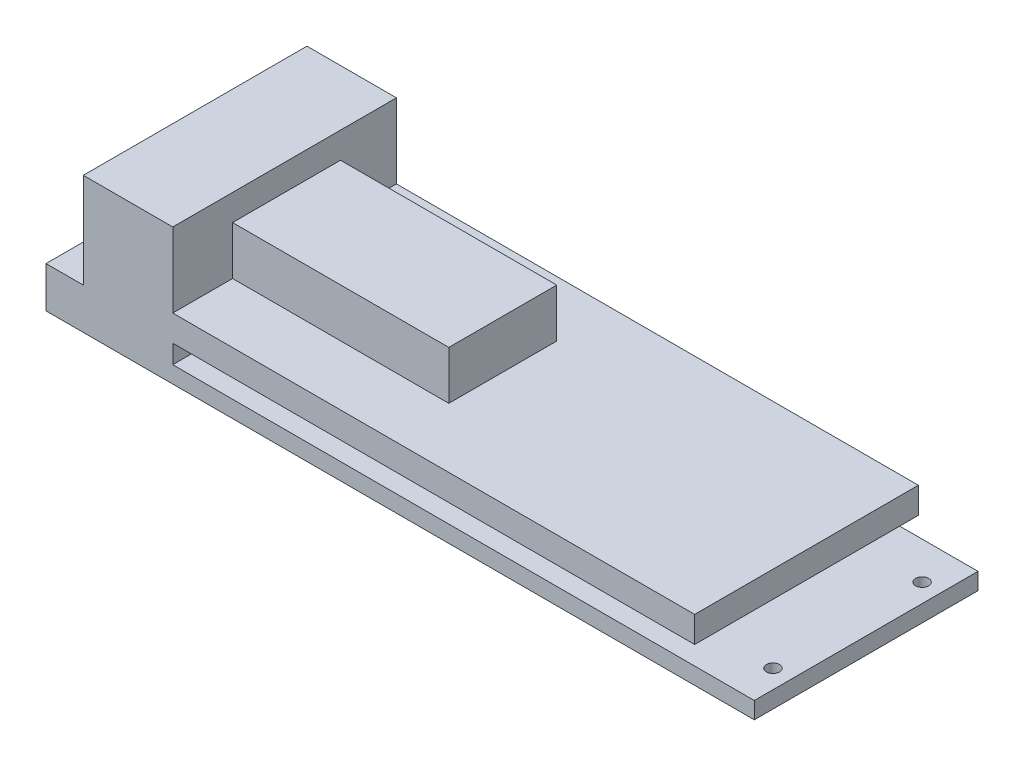
ISO-10303-21;
HEADER;
FILE_DESCRIPTION(('STEP AP214'),'2;1');
FILE_NAME('part.step','',(''),(''),'','','');
FILE_SCHEMA(('AUTOMOTIVE_DESIGN { 1 0 10303 214 1 1 1 1 }'));
ENDSEC;
DATA;
#1=APPLICATION_CONTEXT('core data for automotive mechanical design processes');
#2=APPLICATION_PROTOCOL_DEFINITION('international standard','automotive_design',2000,#1);
#3=PRODUCT_CONTEXT('',#1,'mechanical');
#4=PRODUCT('Part','Part','',(#3));
#5=PRODUCT_RELATED_PRODUCT_CATEGORY('part','',(#4));
#6=PRODUCT_DEFINITION_FORMATION('','',#4);
#7=PRODUCT_DEFINITION_CONTEXT('part definition',#1,'design');
#8=PRODUCT_DEFINITION('design','',#6,#7);
#9=PRODUCT_DEFINITION_SHAPE('','',#8);
#10=(LENGTH_UNIT() NAMED_UNIT(*) SI_UNIT(.MILLI.,.METRE.));
#11=(NAMED_UNIT(*) PLANE_ANGLE_UNIT() SI_UNIT($,.RADIAN.));
#12=(NAMED_UNIT(*) SI_UNIT($,.STERADIAN.) SOLID_ANGLE_UNIT());
#13=UNCERTAINTY_MEASURE_WITH_UNIT(LENGTH_MEASURE(1.E-05),#10,'distance_accuracy_value','');
#14=(GEOMETRIC_REPRESENTATION_CONTEXT(3) GLOBAL_UNCERTAINTY_ASSIGNED_CONTEXT((#13)) GLOBAL_UNIT_ASSIGNED_CONTEXT((#10,
#11,#12)) REPRESENTATION_CONTEXT('',''));
#15=CARTESIAN_POINT('',(0.,0.,0.));
#16=DIRECTION('',(0.,0.,1.));
#17=DIRECTION('',(1.,0.,0.));
#18=AXIS2_PLACEMENT_3D('',#15,#16,#17);
#19=CARTESIAN_POINT('',(-61.,36.5,-30.));
#20=DIRECTION('',(-1.,0.,0.));
#21=DIRECTION('',(0.,0.,1.));
#22=AXIS2_PLACEMENT_3D('',#19,#20,#21);
#23=PLANE('',#22);
#24=DIRECTION('',(0.,-1.,0.));
#25=VECTOR('',#24,1.);
#26=CARTESIAN_POINT('',(-61.,29.5,13.9538213025226));
#27=LINE('',#26,#25);
#28=CARTESIAN_POINT('',(-61.,29.5,13.9538213025226));
#29=VERTEX_POINT('',#28);
#30=CARTESIAN_POINT('',(-61.,16.5,13.9538213025226));
#31=VERTEX_POINT('',#30);
#32=EDGE_CURVE('E186',#29,#31,#27,.T.);
#33=ORIENTED_EDGE('',*,*,#32,.F.);
#34=DIRECTION('',(0.,0.,1.));
#35=VECTOR('',#34,1.);
#36=CARTESIAN_POINT('',(-61.,29.5,-15.));
#37=LINE('',#36,#35);
#38=CARTESIAN_POINT('',(-61.,29.5,-15.));
#39=VERTEX_POINT('',#38);
#40=EDGE_CURVE('E194',#39,#29,#37,.T.);
#41=ORIENTED_EDGE('',*,*,#40,.F.);
#42=DIRECTION('',(0.,-1.,0.));
#43=VECTOR('',#42,1.);
#44=CARTESIAN_POINT('',(-61.,29.5,-15.));
#45=LINE('',#44,#43);
#46=CARTESIAN_POINT('',(-61.,16.5,-15.));
#47=VERTEX_POINT('',#46);
#48=EDGE_CURVE('E413',#39,#47,#45,.T.);
#49=ORIENTED_EDGE('',*,*,#48,.T.);
#50=DIRECTION('',(0.,0.,1.));
#51=VECTOR('',#50,1.);
#52=CARTESIAN_POINT('',(-61.,16.5,-30.));
#53=LINE('',#52,#51);
#54=CARTESIAN_POINT('',(-61.,16.5,-30.));
#55=VERTEX_POINT('',#54);
#56=EDGE_CURVE('E217',#55,#47,#53,.T.);
#57=ORIENTED_EDGE('',*,*,#56,.F.);
#58=DIRECTION('',(0.,-1.,0.));
#59=VECTOR('',#58,1.);
#60=CARTESIAN_POINT('',(-61.,36.5,-30.));
#61=LINE('',#60,#59);
#62=CARTESIAN_POINT('',(-61.,36.5,-30.));
#63=VERTEX_POINT('',#62);
#64=EDGE_CURVE('E297',#63,#55,#61,.T.);
#65=ORIENTED_EDGE('',*,*,#64,.F.);
#66=DIRECTION('',(0.,0.,-1.));
#67=VECTOR('',#66,1.);
#68=CARTESIAN_POINT('',(-61.,36.5,-30.));
#69=LINE('',#68,#67);
#70=CARTESIAN_POINT('',(-61.,36.5,30.));
#71=VERTEX_POINT('',#70);
#72=EDGE_CURVE('E284',#71,#63,#69,.T.);
#73=ORIENTED_EDGE('',*,*,#72,.F.);
#74=DIRECTION('',(0.,-1.,0.));
#75=VECTOR('',#74,1.);
#76=CARTESIAN_POINT('',(-61.,36.5,30.));
#77=LINE('',#76,#75);
#78=CARTESIAN_POINT('',(-61.,16.5,30.));
#79=VERTEX_POINT('',#78);
#80=EDGE_CURVE('E302',#71,#79,#77,.T.);
#81=ORIENTED_EDGE('',*,*,#80,.T.);
#82=EDGE_CURVE('E207',#31,#79,#53,.T.);
#83=ORIENTED_EDGE('',*,*,#82,.F.);
#84=EDGE_LOOP('',(#33,#41,#49,#57,#65,#73,#81,#83));
#85=FACE_BOUND('',#84,.T.);
#86=ADVANCED_FACE('F43',(#85),#23,.F.);
#87=CARTESIAN_POINT('',(0.,16.5,0.));
#88=DIRECTION('',(0.,1.,0.));
#89=DIRECTION('',(0.,0.,1.));
#90=AXIS2_PLACEMENT_3D('',#87,#88,#89);
#91=PLANE('',#90);
#92=DIRECTION('',(0.,0.,-1.));
#93=VECTOR('',#92,1.);
#94=CARTESIAN_POINT('',(-2.99999999999999,16.5,-15.));
#95=LINE('',#94,#93);
#96=CARTESIAN_POINT('',(-2.99999999999999,16.5,13.9538213025226));
#97=VERTEX_POINT('',#96);
#98=CARTESIAN_POINT('',(-2.99999999999999,16.5,-15.));
#99=VERTEX_POINT('',#98);
#100=EDGE_CURVE('E416',#97,#99,#95,.T.);
#101=ORIENTED_EDGE('',*,*,#100,.F.);
#102=DIRECTION('',(1.,0.,0.));
#103=VECTOR('',#102,1.);
#104=CARTESIAN_POINT('',(-61.,16.5,13.9538213025226));
#105=LINE('',#104,#103);
#106=EDGE_CURVE('E399',#31,#97,#105,.T.);
#107=ORIENTED_EDGE('',*,*,#106,.F.);
#108=ORIENTED_EDGE('',*,*,#82,.T.);
#109=DIRECTION('',(1.,0.,0.));
#110=VECTOR('',#109,1.);
#111=CARTESIAN_POINT('',(-61.,16.5,30.));
#112=LINE('',#111,#110);
#113=CARTESIAN_POINT('',(79.,16.5,30.));
#114=VERTEX_POINT('',#113);
#115=EDGE_CURVE('E221',#79,#114,#112,.T.);
#116=ORIENTED_EDGE('',*,*,#115,.T.);
#117=DIRECTION('',(0.,0.,-1.));
#118=VECTOR('',#117,1.);
#119=CARTESIAN_POINT('',(79.,16.5,-30.));
#120=LINE('',#119,#118);
#121=CARTESIAN_POINT('',(79.,16.5,-30.));
#122=VERTEX_POINT('',#121);
#123=EDGE_CURVE('E224',#114,#122,#120,.T.);
#124=ORIENTED_EDGE('',*,*,#123,.T.);
#125=DIRECTION('',(-1.,0.,0.));
#126=VECTOR('',#125,1.);
#127=CARTESIAN_POINT('',(-61.,16.5,-30.));
#128=LINE('',#127,#126);
#129=EDGE_CURVE('E227',#122,#55,#128,.T.);
#130=ORIENTED_EDGE('',*,*,#129,.T.);
#131=ORIENTED_EDGE('',*,*,#56,.T.);
#132=DIRECTION('',(-1.,0.,0.));
#133=VECTOR('',#132,1.);
#134=CARTESIAN_POINT('',(-61.,16.5,-15.));
#135=LINE('',#134,#133);
#136=EDGE_CURVE('E203',#99,#47,#135,.T.);
#137=ORIENTED_EDGE('',*,*,#136,.F.);
#138=EDGE_LOOP('',(#101,#107,#108,#116,#124,#130,#131,#137));
#139=FACE_BOUND('',#138,.T.);
#140=ADVANCED_FACE('F427',(#139),#91,.T.);
#141=DIRECTION('',(0.,0.,1.));
#142=VECTOR('',#141,1.);
#143=CARTESIAN_POINT('',(-61.,9.5,-30.));
#144=LINE('',#143,#142);
#145=CARTESIAN_POINT('',(-61.,9.5,-30.));
#146=VERTEX_POINT('',#145);
#147=CARTESIAN_POINT('',(-61.,9.5,30.));
#148=VERTEX_POINT('',#147);
#149=EDGE_CURVE('E69',#146,#148,#144,.T.);
#150=ORIENTED_EDGE('',*,*,#149,.T.);
#151=CARTESIAN_POINT('',(-61.,4.5,30.));
#152=VERTEX_POINT('',#151);
#153=EDGE_CURVE('E301',#148,#152,#77,.T.);
#154=ORIENTED_EDGE('',*,*,#153,.T.);
#155=DIRECTION('',(0.,0.,-1.));
#156=VECTOR('',#155,1.);
#157=CARTESIAN_POINT('',(-61.,4.5,-30.));
#158=LINE('',#157,#156);
#159=CARTESIAN_POINT('',(-61.,4.5,-30.));
#160=VERTEX_POINT('',#159);
#161=EDGE_CURVE('E276',#152,#160,#158,.T.);
#162=ORIENTED_EDGE('',*,*,#161,.T.);
#163=EDGE_CURVE('E296',#146,#160,#61,.T.);
#164=ORIENTED_EDGE('',*,*,#163,.F.);
#165=EDGE_LOOP('',(#150,#154,#162,#164));
#166=FACE_BOUND('',#165,.T.);
#167=ADVANCED_FACE('F451',(#166),#23,.F.);
#168=CARTESIAN_POINT('',(-85.,36.5,-30.));
#169=DIRECTION('',(1.,0.,0.));
#170=DIRECTION('',(0.,0.,-1.));
#171=AXIS2_PLACEMENT_3D('',#168,#169,#170);
#172=PLANE('',#171);
#173=DIRECTION('',(0.,0.,-1.));
#174=VECTOR('',#173,1.);
#175=CARTESIAN_POINT('',(-85.,11.,-30.));
#176=LINE('',#175,#174);
#177=CARTESIAN_POINT('',(-85.,11.,30.));
#178=VERTEX_POINT('',#177);
#179=CARTESIAN_POINT('',(-85.,11.,-30.));
#180=VERTEX_POINT('',#179);
#181=EDGE_CURVE('E317',#178,#180,#176,.T.);
#182=ORIENTED_EDGE('',*,*,#181,.F.);
#183=DIRECTION('',(0.,-1.,0.));
#184=VECTOR('',#183,1.);
#185=CARTESIAN_POINT('',(-85.,36.5,30.));
#186=LINE('',#185,#184);
#187=CARTESIAN_POINT('',(-85.,36.5,30.));
#188=VERTEX_POINT('',#187);
#189=EDGE_CURVE('E305',#188,#178,#186,.T.);
#190=ORIENTED_EDGE('',*,*,#189,.F.);
#191=DIRECTION('',(0.,0.,1.));
#192=VECTOR('',#191,1.);
#193=CARTESIAN_POINT('',(-85.,36.5,-30.));
#194=LINE('',#193,#192);
#195=CARTESIAN_POINT('',(-85.,36.5,-30.));
#196=VERTEX_POINT('',#195);
#197=EDGE_CURVE('E277',#196,#188,#194,.T.);
#198=ORIENTED_EDGE('',*,*,#197,.F.);
#199=DIRECTION('',(0.,-1.,0.));
#200=VECTOR('',#199,1.);
#201=CARTESIAN_POINT('',(-85.,36.5,-30.));
#202=LINE('',#201,#200);
#203=EDGE_CURVE('E290',#196,#180,#202,.T.);
#204=ORIENTED_EDGE('',*,*,#203,.T.);
#205=EDGE_LOOP('',(#182,#190,#198,#204));
#206=FACE_BOUND('',#205,.T.);
#207=DIRECTION('',(0.,0.,-1.));
#208=VECTOR('',#207,1.);
#209=CARTESIAN_POINT('',(-85.,26.,-30.));
#210=LINE('',#209,#208);
#211=CARTESIAN_POINT('',(-85.,26.,12.9191431582392));
#212=VERTEX_POINT('',#211);
#213=CARTESIAN_POINT('',(-85.,26.,-12.0808568417608));
#214=VERTEX_POINT('',#213);
#215=EDGE_CURVE('E11',#212,#214,#210,.T.);
#216=ORIENTED_EDGE('',*,*,#215,.F.);
#217=DIRECTION('',(0.,1.,0.));
#218=VECTOR('',#217,1.);
#219=CARTESIAN_POINT('',(-85.,36.5,12.9191431582392));
#220=LINE('',#219,#218);
#221=CARTESIAN_POINT('',(-85.,19.,12.9191431582392));
#222=VERTEX_POINT('',#221);
#223=EDGE_CURVE('E385',#222,#212,#220,.T.);
#224=ORIENTED_EDGE('',*,*,#223,.F.);
#225=DIRECTION('',(0.,0.,-1.));
#226=VECTOR('',#225,1.);
#227=CARTESIAN_POINT('',(-85.,19.,-30.));
#228=LINE('',#227,#226);
#229=CARTESIAN_POINT('',(-85.,19.,-12.0808568417608));
#230=VERTEX_POINT('',#229);
#231=EDGE_CURVE('E381',#222,#230,#228,.T.);
#232=ORIENTED_EDGE('',*,*,#231,.T.);
#233=DIRECTION('',(0.,-1.,0.));
#234=VECTOR('',#233,1.);
#235=CARTESIAN_POINT('',(-85.,36.5,-12.0808568417608));
#236=LINE('',#235,#234);
#237=EDGE_CURVE('E53',#214,#230,#236,.T.);
#238=ORIENTED_EDGE('',*,*,#237,.F.);
#239=EDGE_LOOP('',(#216,#224,#232,#238));
#240=FACE_BOUND('',#239,.T.);
#241=ADVANCED_FACE('F487',(#206,#240),#172,.F.);
#242=CARTESIAN_POINT('',(0.,4.5,0.));
#243=DIRECTION('',(0.,1.,0.));
#244=DIRECTION('',(0.,0.,1.));
#245=AXIS2_PLACEMENT_3D('',#242,#243,#244);
#246=PLANE('',#245);
#247=CARTESIAN_POINT('',(90.,4.5,20.));
#248=DIRECTION('',(0.,1.,0.));
#249=DIRECTION('',(0.,0.,1.));
#250=AXIS2_PLACEMENT_3D('',#247,#248,#249);
#251=CIRCLE('',#250,1.75);
#252=CARTESIAN_POINT('',(90.,4.5,21.75));
#253=VERTEX_POINT('',#252);
#254=EDGE_CURVE('E334',#253,#253,#251,.T.);
#255=ORIENTED_EDGE('',*,*,#254,.F.);
#256=EDGE_LOOP('',(#255));
#257=FACE_BOUND('',#256,.T.);
#258=CARTESIAN_POINT('',(90.,4.5,-20.));
#259=DIRECTION('',(0.,1.,0.));
#260=DIRECTION('',(0.,0.,1.));
#261=AXIS2_PLACEMENT_3D('',#258,#259,#260);
#262=CIRCLE('',#261,1.75);
#263=CARTESIAN_POINT('',(90.,4.5,-18.25));
#264=VERTEX_POINT('',#263);
#265=EDGE_CURVE('E326',#264,#264,#262,.T.);
#266=ORIENTED_EDGE('',*,*,#265,.F.);
#267=EDGE_LOOP('',(#266));
#268=FACE_BOUND('',#267,.T.);
#269=DIRECTION('',(-1.,0.,0.));
#270=VECTOR('',#269,1.);
#271=CARTESIAN_POINT('',(-95.,4.5,-30.));
#272=LINE('',#271,#270);
#273=CARTESIAN_POINT('',(95.,4.5,-30.));
#274=VERTEX_POINT('',#273);
#275=EDGE_CURVE('E346',#274,#160,#272,.T.);
#276=ORIENTED_EDGE('',*,*,#275,.T.);
#277=ORIENTED_EDGE('',*,*,#161,.F.);
#278=DIRECTION('',(1.,0.,0.));
#279=VECTOR('',#278,1.);
#280=CARTESIAN_POINT('',(-95.,4.5,30.));
#281=LINE('',#280,#279);
#282=CARTESIAN_POINT('',(95.,4.5,30.));
#283=VERTEX_POINT('',#282);
#284=EDGE_CURVE('E351',#152,#283,#281,.T.);
#285=ORIENTED_EDGE('',*,*,#284,.T.);
#286=DIRECTION('',(0.,0.,-1.));
#287=VECTOR('',#286,1.);
#288=CARTESIAN_POINT('',(95.,4.5,-30.));
#289=LINE('',#288,#287);
#290=EDGE_CURVE('E342',#283,#274,#289,.T.);
#291=ORIENTED_EDGE('',*,*,#290,.T.);
#292=EDGE_LOOP('',(#276,#277,#285,#291));
#293=FACE_BOUND('',#292,.T.);
#294=ADVANCED_FACE('F454',(#257,#268,#293),#246,.T.);
#295=CARTESIAN_POINT('',(0.,0.,0.));
#296=DIRECTION('',(0.,1.,0.));
#297=DIRECTION('',(0.,0.,1.));
#298=AXIS2_PLACEMENT_3D('',#295,#296,#297);
#299=PLANE('',#298);
#300=CARTESIAN_POINT('',(-89.,0.,-20.));
#301=DIRECTION('',(0.,-1.,0.));
#302=DIRECTION('',(0.,0.,-1.));
#303=AXIS2_PLACEMENT_3D('',#300,#301,#302);
#304=CIRCLE('',#303,1.75);
#305=CARTESIAN_POINT('',(-89.,0.,-21.75));
#306=VERTEX_POINT('',#305);
#307=EDGE_CURVE('E393',#306,#306,#304,.T.);
#308=ORIENTED_EDGE('',*,*,#307,.F.);
#309=EDGE_LOOP('',(#308));
#310=FACE_BOUND('',#309,.T.);
#311=CARTESIAN_POINT('',(-89.,0.,19.9554648735045));
#312=DIRECTION('',(0.,-1.,0.));
#313=DIRECTION('',(0.,0.,-1.));
#314=AXIS2_PLACEMENT_3D('',#311,#312,#313);
#315=CIRCLE('',#314,1.75);
#316=CARTESIAN_POINT('',(-89.,0.,18.2054648735045));
#317=VERTEX_POINT('',#316);
#318=EDGE_CURVE('E401',#317,#317,#315,.T.);
#319=ORIENTED_EDGE('',*,*,#318,.F.);
#320=EDGE_LOOP('',(#319));
#321=FACE_BOUND('',#320,.T.);
#322=DIRECTION('',(0.,0.,-1.));
#323=VECTOR('',#322,1.);
#324=CARTESIAN_POINT('',(95.,0.,-30.));
#325=LINE('',#324,#323);
#326=CARTESIAN_POINT('',(95.,0.,30.));
#327=VERTEX_POINT('',#326);
#328=CARTESIAN_POINT('',(95.,0.,-30.));
#329=VERTEX_POINT('',#328);
#330=EDGE_CURVE('E338',#327,#329,#325,.T.);
#331=ORIENTED_EDGE('',*,*,#330,.F.);
#332=DIRECTION('',(1.,0.,0.));
#333=VECTOR('',#332,1.);
#334=CARTESIAN_POINT('',(-95.,0.,30.));
#335=LINE('',#334,#333);
#336=CARTESIAN_POINT('',(-95.,0.,30.));
#337=VERTEX_POINT('',#336);
#338=EDGE_CURVE('E347',#337,#327,#335,.T.);
#339=ORIENTED_EDGE('',*,*,#338,.F.);
#340=DIRECTION('',(0.,0.,1.));
#341=VECTOR('',#340,1.);
#342=CARTESIAN_POINT('',(-95.,0.,-30.));
#343=LINE('',#342,#341);
#344=CARTESIAN_POINT('',(-95.,0.,-30.));
#345=VERTEX_POINT('',#344);
#346=EDGE_CURVE('E361',#345,#337,#343,.T.);
#347=ORIENTED_EDGE('',*,*,#346,.F.);
#348=DIRECTION('',(-1.,0.,0.));
#349=VECTOR('',#348,1.);
#350=CARTESIAN_POINT('',(-95.,0.,-30.));
#351=LINE('',#350,#349);
#352=EDGE_CURVE('E358',#329,#345,#351,.T.);
#353=ORIENTED_EDGE('',*,*,#352,.F.);
#354=EDGE_LOOP('',(#331,#339,#347,#353));
#355=FACE_BOUND('',#354,.T.);
#356=CARTESIAN_POINT('',(90.,0.,20.));
#357=DIRECTION('',(0.,1.,0.));
#358=DIRECTION('',(0.,0.,1.));
#359=AXIS2_PLACEMENT_3D('',#356,#357,#358);
#360=CIRCLE('',#359,1.75);
#361=CARTESIAN_POINT('',(90.,0.,21.75));
#362=VERTEX_POINT('',#361);
#363=EDGE_CURVE('E330',#362,#362,#360,.T.);
#364=ORIENTED_EDGE('',*,*,#363,.T.);
#365=EDGE_LOOP('',(#364));
#366=FACE_BOUND('',#365,.T.);
#367=CARTESIAN_POINT('',(90.,0.,-20.));
#368=DIRECTION('',(0.,1.,0.));
#369=DIRECTION('',(0.,0.,1.));
#370=AXIS2_PLACEMENT_3D('',#367,#368,#369);
#371=CIRCLE('',#370,1.75);
#372=CARTESIAN_POINT('',(90.,0.,-18.25));
#373=VERTEX_POINT('',#372);
#374=EDGE_CURVE('E325',#373,#373,#371,.T.);
#375=ORIENTED_EDGE('',*,*,#374,.T.);
#376=EDGE_LOOP('',(#375));
#377=FACE_BOUND('',#376,.T.);
#378=ADVANCED_FACE('F495',(#310,#321,#355,#366,#377),#299,.F.);
#379=CARTESIAN_POINT('',(95.,4.5,-30.));
#380=DIRECTION('',(-1.,0.,0.));
#381=DIRECTION('',(0.,0.,1.));
#382=AXIS2_PLACEMENT_3D('',#379,#380,#381);
#383=PLANE('',#382);
#384=ORIENTED_EDGE('',*,*,#330,.T.);
#385=DIRECTION('',(0.,-1.,0.));
#386=VECTOR('',#385,1.);
#387=CARTESIAN_POINT('',(95.,4.5,-30.));
#388=LINE('',#387,#386);
#389=EDGE_CURVE('E377',#274,#329,#388,.T.);
#390=ORIENTED_EDGE('',*,*,#389,.F.);
#391=ORIENTED_EDGE('',*,*,#290,.F.);
#392=DIRECTION('',(0.,-1.,0.));
#393=VECTOR('',#392,1.);
#394=CARTESIAN_POINT('',(95.,4.5,30.));
#395=LINE('',#394,#393);
#396=EDGE_CURVE('E354',#283,#327,#395,.T.);
#397=ORIENTED_EDGE('',*,*,#396,.T.);
#398=EDGE_LOOP('',(#384,#390,#391,#397));
#399=FACE_BOUND('',#398,.T.);
#400=ADVANCED_FACE('F45',(#399),#383,.F.);
#401=CARTESIAN_POINT('',(-95.,4.5,-30.));
#402=DIRECTION('',(0.,0.,1.));
#403=DIRECTION('',(1.,0.,0.));
#404=AXIS2_PLACEMENT_3D('',#401,#402,#403);
#405=PLANE('',#404);
#406=ORIENTED_EDGE('',*,*,#352,.T.);
#407=DIRECTION('',(0.,-1.,0.));
#408=VECTOR('',#407,1.);
#409=CARTESIAN_POINT('',(-95.,4.5,-30.));
#410=LINE('',#409,#408);
#411=CARTESIAN_POINT('',(-95.,11.,-30.));
#412=VERTEX_POINT('',#411);
#413=EDGE_CURVE('E373',#412,#345,#410,.T.);
#414=ORIENTED_EDGE('',*,*,#413,.F.);
#415=DIRECTION('',(-1.,0.,0.));
#416=VECTOR('',#415,1.);
#417=CARTESIAN_POINT('',(-95.,11.,-30.));
#418=LINE('',#417,#416);
#419=EDGE_CURVE('E321',#180,#412,#418,.T.);
#420=ORIENTED_EDGE('',*,*,#419,.F.);
#421=ORIENTED_EDGE('',*,*,#203,.F.);
#422=DIRECTION('',(-1.,0.,0.));
#423=VECTOR('',#422,1.);
#424=CARTESIAN_POINT('',(-85.,36.5,-30.));
#425=LINE('',#424,#423);
#426=EDGE_CURVE('E287',#63,#196,#425,.T.);
#427=ORIENTED_EDGE('',*,*,#426,.F.);
#428=ORIENTED_EDGE('',*,*,#64,.T.);
#429=ORIENTED_EDGE('',*,*,#129,.F.);
#430=DIRECTION('',(0.,-1.,0.));
#431=VECTOR('',#430,1.);
#432=CARTESIAN_POINT('',(79.,16.5,-30.));
#433=LINE('',#432,#431);
#434=CARTESIAN_POINT('',(79.,9.5,-30.));
#435=VERTEX_POINT('',#434);
#436=EDGE_CURVE('E230',#122,#435,#433,.T.);
#437=ORIENTED_EDGE('',*,*,#436,.T.);
#438=DIRECTION('',(-1.,0.,0.));
#439=VECTOR('',#438,1.);
#440=CARTESIAN_POINT('',(-61.,9.5,-30.));
#441=LINE('',#440,#439);
#442=EDGE_CURVE('E237',#435,#146,#441,.T.);
#443=ORIENTED_EDGE('',*,*,#442,.T.);
#444=ORIENTED_EDGE('',*,*,#163,.T.);
#445=ORIENTED_EDGE('',*,*,#275,.F.);
#446=ORIENTED_EDGE('',*,*,#389,.T.);
#447=EDGE_LOOP('',(#406,#414,#420,#421,#427,#428,#429,#437,#443,#444,#445,#446));
#448=FACE_BOUND('',#447,.T.);
#449=ADVANCED_FACE('F432',(#448),#405,.F.);
#450=CARTESIAN_POINT('',(-95.,4.5,-30.));
#451=DIRECTION('',(1.,0.,0.));
#452=DIRECTION('',(0.,0.,-1.));
#453=AXIS2_PLACEMENT_3D('',#450,#451,#452);
#454=PLANE('',#453);
#455=ORIENTED_EDGE('',*,*,#346,.T.);
#456=DIRECTION('',(0.,-1.,0.));
#457=VECTOR('',#456,1.);
#458=CARTESIAN_POINT('',(-95.,4.5,30.));
#459=LINE('',#458,#457);
#460=CARTESIAN_POINT('',(-95.,11.,30.));
#461=VERTEX_POINT('',#460);
#462=EDGE_CURVE('E369',#461,#337,#459,.T.);
#463=ORIENTED_EDGE('',*,*,#462,.F.);
#464=DIRECTION('',(0.,0.,1.));
#465=VECTOR('',#464,1.);
#466=CARTESIAN_POINT('',(-95.,11.,-30.));
#467=LINE('',#466,#465);
#468=EDGE_CURVE('E309',#412,#461,#467,.T.);
#469=ORIENTED_EDGE('',*,*,#468,.F.);
#470=ORIENTED_EDGE('',*,*,#413,.T.);
#471=EDGE_LOOP('',(#455,#463,#469,#470));
#472=FACE_BOUND('',#471,.T.);
#473=ADVANCED_FACE('F517',(#472),#454,.F.);
#474=CARTESIAN_POINT('',(-95.,4.5,30.));
#475=DIRECTION('',(0.,0.,-1.));
#476=DIRECTION('',(-1.,0.,0.));
#477=AXIS2_PLACEMENT_3D('',#474,#475,#476);
#478=PLANE('',#477);
#479=ORIENTED_EDGE('',*,*,#284,.F.);
#480=ORIENTED_EDGE('',*,*,#153,.F.);
#481=DIRECTION('',(1.,0.,0.));
#482=VECTOR('',#481,1.);
#483=CARTESIAN_POINT('',(-61.,9.5,30.));
#484=LINE('',#483,#482);
#485=CARTESIAN_POINT('',(79.,9.5,30.));
#486=VERTEX_POINT('',#485);
#487=EDGE_CURVE('E212',#148,#486,#484,.T.);
#488=ORIENTED_EDGE('',*,*,#487,.T.);
#489=DIRECTION('',(0.,-1.,0.));
#490=VECTOR('',#489,1.);
#491=CARTESIAN_POINT('',(79.,16.5,30.));
#492=LINE('',#491,#490);
#493=EDGE_CURVE('E244',#114,#486,#492,.T.);
#494=ORIENTED_EDGE('',*,*,#493,.F.);
#495=ORIENTED_EDGE('',*,*,#115,.F.);
#496=ORIENTED_EDGE('',*,*,#80,.F.);
#497=DIRECTION('',(1.,0.,0.));
#498=VECTOR('',#497,1.);
#499=CARTESIAN_POINT('',(-85.,36.5,30.));
#500=LINE('',#499,#498);
#501=EDGE_CURVE('E281',#188,#71,#500,.T.);
#502=ORIENTED_EDGE('',*,*,#501,.F.);
#503=ORIENTED_EDGE('',*,*,#189,.T.);
#504=DIRECTION('',(1.,0.,0.));
#505=VECTOR('',#504,1.);
#506=CARTESIAN_POINT('',(-95.,11.,30.));
#507=LINE('',#506,#505);
#508=EDGE_CURVE('E313',#461,#178,#507,.T.);
#509=ORIENTED_EDGE('',*,*,#508,.F.);
#510=ORIENTED_EDGE('',*,*,#462,.T.);
#511=ORIENTED_EDGE('',*,*,#338,.T.);
#512=ORIENTED_EDGE('',*,*,#396,.F.);
#513=EDGE_LOOP('',(#479,#480,#488,#494,#495,#496,#502,#503,#509,#510,#511,#512));
#514=FACE_BOUND('',#513,.T.);
#515=ADVANCED_FACE('F445',(#514),#478,.F.);
#516=CARTESIAN_POINT('',(90.,4.5,20.));
#517=DIRECTION('',(0.,-1.,0.));
#518=DIRECTION('',(0.,0.,-1.));
#519=AXIS2_PLACEMENT_3D('',#516,#517,#518);
#520=CYLINDRICAL_SURFACE('',#519,1.75);
#521=ORIENTED_EDGE('',*,*,#254,.T.);
#522=EDGE_LOOP('',(#521));
#523=FACE_BOUND('',#522,.T.);
#524=ORIENTED_EDGE('',*,*,#363,.F.);
#525=EDGE_LOOP('',(#524));
#526=FACE_BOUND('',#525,.T.);
#527=ADVANCED_FACE('F507',(#523,#526),#520,.F.);
#528=CARTESIAN_POINT('',(90.,4.5,-20.));
#529=DIRECTION('',(0.,-1.,0.));
#530=DIRECTION('',(0.,0.,-1.));
#531=AXIS2_PLACEMENT_3D('',#528,#529,#530);
#532=CYLINDRICAL_SURFACE('',#531,1.75);
#533=ORIENTED_EDGE('',*,*,#265,.T.);
#534=EDGE_LOOP('',(#533));
#535=FACE_BOUND('',#534,.T.);
#536=ORIENTED_EDGE('',*,*,#374,.F.);
#537=EDGE_LOOP('',(#536));
#538=FACE_BOUND('',#537,.T.);
#539=ADVANCED_FACE('F503',(#535,#538),#532,.F.);
#540=CARTESIAN_POINT('',(0.,11.,0.));
#541=DIRECTION('',(0.,1.,0.));
#542=DIRECTION('',(0.,0.,1.));
#543=AXIS2_PLACEMENT_3D('',#540,#541,#542);
#544=PLANE('',#543);
#545=CARTESIAN_POINT('',(-89.,11.,-20.));
#546=DIRECTION('',(0.,1.,0.));
#547=DIRECTION('',(0.,0.,1.));
#548=AXIS2_PLACEMENT_3D('',#545,#546,#547);
#549=CIRCLE('',#548,1.75);
#550=CARTESIAN_POINT('',(-89.,11.,-21.75));
#551=VERTEX_POINT('',#550);
#552=EDGE_CURVE('E47',#551,#551,#549,.T.);
#553=ORIENTED_EDGE('',*,*,#552,.F.);
#554=EDGE_LOOP('',(#553));
#555=FACE_BOUND('',#554,.T.);
#556=CARTESIAN_POINT('',(-89.,11.,19.9554648735045));
#557=DIRECTION('',(0.,1.,0.));
#558=DIRECTION('',(0.,0.,1.));
#559=AXIS2_PLACEMENT_3D('',#556,#557,#558);
#560=CIRCLE('',#559,1.75);
#561=CARTESIAN_POINT('',(-89.,11.,18.2054648735045));
#562=VERTEX_POINT('',#561);
#563=EDGE_CURVE('E390',#562,#562,#560,.T.);
#564=ORIENTED_EDGE('',*,*,#563,.F.);
#565=EDGE_LOOP('',(#564));
#566=FACE_BOUND('',#565,.T.);
#567=ORIENTED_EDGE('',*,*,#468,.T.);
#568=ORIENTED_EDGE('',*,*,#508,.T.);
#569=ORIENTED_EDGE('',*,*,#181,.T.);
#570=ORIENTED_EDGE('',*,*,#419,.T.);
#571=EDGE_LOOP('',(#567,#568,#569,#570));
#572=FACE_BOUND('',#571,.T.);
#573=ADVANCED_FACE('F500',(#555,#566,#572),#544,.T.);
#574=CARTESIAN_POINT('',(0.,36.5,0.));
#575=DIRECTION('',(0.,1.,0.));
#576=DIRECTION('',(0.,0.,1.));
#577=AXIS2_PLACEMENT_3D('',#574,#575,#576);
#578=PLANE('',#577);
#579=ORIENTED_EDGE('',*,*,#197,.T.);
#580=ORIENTED_EDGE('',*,*,#501,.T.);
#581=ORIENTED_EDGE('',*,*,#72,.T.);
#582=ORIENTED_EDGE('',*,*,#426,.T.);
#583=EDGE_LOOP('',(#579,#580,#581,#582));
#584=FACE_BOUND('',#583,.T.);
#585=ADVANCED_FACE('F440',(#584),#578,.T.);
#586=CARTESIAN_POINT('',(-74.2267590867374,26.,-12.0808568417608));
#587=DIRECTION('',(0.,0.,1.));
#588=DIRECTION('',(1.,0.,0.));
#589=AXIS2_PLACEMENT_3D('',#586,#587,#588);
#590=PLANE('',#589);
#591=DIRECTION('',(-1.,0.,0.));
#592=VECTOR('',#591,1.);
#593=CARTESIAN_POINT('',(-74.2267590867374,26.,-12.0808568417608));
#594=LINE('',#593,#592);
#595=CARTESIAN_POINT('',(-94.2267590867374,26.,-12.0808568417608));
#596=VERTEX_POINT('',#595);
#597=EDGE_CURVE('E249',#214,#596,#594,.T.);
#598=ORIENTED_EDGE('',*,*,#597,.F.);
#599=ORIENTED_EDGE('',*,*,#237,.T.);
#600=DIRECTION('',(-1.,0.,0.));
#601=VECTOR('',#600,1.);
#602=CARTESIAN_POINT('',(-74.2267590867374,19.,-12.0808568417608));
#603=LINE('',#602,#601);
#604=CARTESIAN_POINT('',(-94.2267590867374,19.,-12.0808568417608));
#605=VERTEX_POINT('',#604);
#606=EDGE_CURVE('E248',#230,#605,#603,.T.);
#607=ORIENTED_EDGE('',*,*,#606,.T.);
#608=DIRECTION('',(0.,-1.,0.));
#609=VECTOR('',#608,1.);
#610=CARTESIAN_POINT('',(-94.2267590867374,26.,-12.0808568417608));
#611=LINE('',#610,#609);
#612=EDGE_CURVE('E272',#596,#605,#611,.T.);
#613=ORIENTED_EDGE('',*,*,#612,.F.);
#614=EDGE_LOOP('',(#598,#599,#607,#613));
#615=FACE_BOUND('',#614,.T.);
#616=ADVANCED_FACE('F551',(#615),#590,.F.);
#617=CARTESIAN_POINT('',(-74.2267590867374,26.,12.9191431582392));
#618=DIRECTION('',(0.,0.,-1.));
#619=DIRECTION('',(-1.,0.,0.));
#620=AXIS2_PLACEMENT_3D('',#617,#618,#619);
#621=PLANE('',#620);
#622=DIRECTION('',(1.,0.,0.));
#623=VECTOR('',#622,1.);
#624=CARTESIAN_POINT('',(-74.2267590867374,19.,12.9191431582392));
#625=LINE('',#624,#623);
#626=CARTESIAN_POINT('',(-94.2267590867374,19.,12.9191431582392));
#627=VERTEX_POINT('',#626);
#628=EDGE_CURVE('E253',#627,#222,#625,.T.);
#629=ORIENTED_EDGE('',*,*,#628,.T.);
#630=ORIENTED_EDGE('',*,*,#223,.T.);
#631=DIRECTION('',(1.,0.,0.));
#632=VECTOR('',#631,1.);
#633=CARTESIAN_POINT('',(-74.2267590867374,26.,12.9191431582392));
#634=LINE('',#633,#632);
#635=CARTESIAN_POINT('',(-94.2267590867374,26.,12.9191431582392));
#636=VERTEX_POINT('',#635);
#637=EDGE_CURVE('E256',#636,#212,#634,.T.);
#638=ORIENTED_EDGE('',*,*,#637,.F.);
#639=DIRECTION('',(0.,-1.,0.));
#640=VECTOR('',#639,1.);
#641=CARTESIAN_POINT('',(-94.2267590867374,26.,12.9191431582392));
#642=LINE('',#641,#640);
#643=EDGE_CURVE('E260',#636,#627,#642,.T.);
#644=ORIENTED_EDGE('',*,*,#643,.T.);
#645=EDGE_LOOP('',(#629,#630,#638,#644));
#646=FACE_BOUND('',#645,.T.);
#647=ADVANCED_FACE('F566',(#646),#621,.F.);
#648=CARTESIAN_POINT('',(0.,26.,0.));
#649=DIRECTION('',(0.,-1.,0.));
#650=DIRECTION('',(0.,0.,-1.));
#651=AXIS2_PLACEMENT_3D('',#648,#649,#650);
#652=PLANE('',#651);
#653=ORIENTED_EDGE('',*,*,#637,.T.);
#654=ORIENTED_EDGE('',*,*,#215,.T.);
#655=ORIENTED_EDGE('',*,*,#597,.T.);
#656=DIRECTION('',(0.,0.,1.));
#657=VECTOR('',#656,1.);
#658=CARTESIAN_POINT('',(-94.2267590867374,26.,-12.0808568417608));
#659=LINE('',#658,#657);
#660=EDGE_CURVE('E252',#596,#636,#659,.T.);
#661=ORIENTED_EDGE('',*,*,#660,.T.);
#662=EDGE_LOOP('',(#653,#654,#655,#661));
#663=FACE_BOUND('',#662,.T.);
#664=ADVANCED_FACE('F576',(#663),#652,.F.);
#665=CARTESIAN_POINT('',(0.,19.,0.));
#666=DIRECTION('',(0.,-1.,0.));
#667=DIRECTION('',(0.,0.,-1.));
#668=AXIS2_PLACEMENT_3D('',#665,#666,#667);
#669=PLANE('',#668);
#670=ORIENTED_EDGE('',*,*,#231,.F.);
#671=ORIENTED_EDGE('',*,*,#628,.F.);
#672=DIRECTION('',(0.,0.,1.));
#673=VECTOR('',#672,1.);
#674=CARTESIAN_POINT('',(-94.2267590867374,19.,-12.0808568417608));
#675=LINE('',#674,#673);
#676=EDGE_CURVE('E263',#605,#627,#675,.T.);
#677=ORIENTED_EDGE('',*,*,#676,.F.);
#678=ORIENTED_EDGE('',*,*,#606,.F.);
#679=EDGE_LOOP('',(#670,#671,#677,#678));
#680=FACE_BOUND('',#679,.T.);
#681=ADVANCED_FACE('F474',(#680),#669,.T.);
#682=CARTESIAN_POINT('',(-94.2267590867374,26.,-12.0808568417608));
#683=DIRECTION('',(1.,0.,0.));
#684=DIRECTION('',(0.,0.,-1.));
#685=AXIS2_PLACEMENT_3D('',#682,#683,#684);
#686=PLANE('',#685);
#687=ORIENTED_EDGE('',*,*,#676,.T.);
#688=ORIENTED_EDGE('',*,*,#643,.F.);
#689=ORIENTED_EDGE('',*,*,#660,.F.);
#690=ORIENTED_EDGE('',*,*,#612,.T.);
#691=EDGE_LOOP('',(#687,#688,#689,#690));
#692=FACE_BOUND('',#691,.T.);
#693=ADVANCED_FACE('F467',(#692),#686,.F.);
#694=CARTESIAN_POINT('',(79.,16.5,-30.));
#695=DIRECTION('',(-1.,0.,0.));
#696=DIRECTION('',(0.,0.,1.));
#697=AXIS2_PLACEMENT_3D('',#694,#695,#696);
#698=PLANE('',#697);
#699=DIRECTION('',(0.,0.,-1.));
#700=VECTOR('',#699,1.);
#701=CARTESIAN_POINT('',(79.,9.5,-30.));
#702=LINE('',#701,#700);
#703=EDGE_CURVE('E234',#486,#435,#702,.T.);
#704=ORIENTED_EDGE('',*,*,#703,.T.);
#705=ORIENTED_EDGE('',*,*,#436,.F.);
#706=ORIENTED_EDGE('',*,*,#123,.F.);
#707=ORIENTED_EDGE('',*,*,#493,.T.);
#708=EDGE_LOOP('',(#704,#705,#706,#707));
#709=FACE_BOUND('',#708,.T.);
#710=ADVANCED_FACE('F465',(#709),#698,.F.);
#711=CARTESIAN_POINT('',(0.,9.5,0.));
#712=DIRECTION('',(0.,1.,0.));
#713=DIRECTION('',(0.,0.,1.));
#714=AXIS2_PLACEMENT_3D('',#711,#712,#713);
#715=PLANE('',#714);
#716=ORIENTED_EDGE('',*,*,#149,.F.);
#717=ORIENTED_EDGE('',*,*,#442,.F.);
#718=ORIENTED_EDGE('',*,*,#703,.F.);
#719=ORIENTED_EDGE('',*,*,#487,.F.);
#720=EDGE_LOOP('',(#716,#717,#718,#719));
#721=FACE_BOUND('',#720,.T.);
#722=ADVANCED_FACE('F463',(#721),#715,.F.);
#723=CARTESIAN_POINT('',(-61.,29.5,13.9538213025226));
#724=DIRECTION('',(0.,0.,-1.));
#725=DIRECTION('',(-1.,0.,0.));
#726=AXIS2_PLACEMENT_3D('',#723,#724,#725);
#727=PLANE('',#726);
#728=ORIENTED_EDGE('',*,*,#106,.T.);
#729=DIRECTION('',(0.,-1.,0.));
#730=VECTOR('',#729,1.);
#731=CARTESIAN_POINT('',(-2.99999999999999,29.5,13.9538213025226));
#732=LINE('',#731,#730);
#733=CARTESIAN_POINT('',(-2.99999999999999,29.5,13.9538213025226));
#734=VERTEX_POINT('',#733);
#735=EDGE_CURVE('E189',#734,#97,#732,.T.);
#736=ORIENTED_EDGE('',*,*,#735,.F.);
#737=DIRECTION('',(1.,0.,0.));
#738=VECTOR('',#737,1.);
#739=CARTESIAN_POINT('',(-61.,29.5,13.9538213025226));
#740=LINE('',#739,#738);
#741=EDGE_CURVE('E182',#29,#734,#740,.T.);
#742=ORIENTED_EDGE('',*,*,#741,.F.);
#743=ORIENTED_EDGE('',*,*,#32,.T.);
#744=EDGE_LOOP('',(#728,#736,#742,#743));
#745=FACE_BOUND('',#744,.T.);
#746=ADVANCED_FACE('F184',(#745),#727,.F.);
#747=CARTESIAN_POINT('',(-2.99999999999999,29.5,-15.));
#748=DIRECTION('',(-1.,0.,0.));
#749=DIRECTION('',(0.,0.,1.));
#750=AXIS2_PLACEMENT_3D('',#747,#748,#749);
#751=PLANE('',#750);
#752=ORIENTED_EDGE('',*,*,#100,.T.);
#753=DIRECTION('',(0.,-1.,0.));
#754=VECTOR('',#753,1.);
#755=CARTESIAN_POINT('',(-2.99999999999999,29.5,-15.));
#756=LINE('',#755,#754);
#757=CARTESIAN_POINT('',(-2.99999999999999,29.5,-15.));
#758=VERTEX_POINT('',#757);
#759=EDGE_CURVE('E61',#758,#99,#756,.T.);
#760=ORIENTED_EDGE('',*,*,#759,.F.);
#761=DIRECTION('',(0.,0.,-1.));
#762=VECTOR('',#761,1.);
#763=CARTESIAN_POINT('',(-2.99999999999999,29.5,-15.));
#764=LINE('',#763,#762);
#765=EDGE_CURVE('E193',#734,#758,#764,.T.);
#766=ORIENTED_EDGE('',*,*,#765,.F.);
#767=ORIENTED_EDGE('',*,*,#735,.T.);
#768=EDGE_LOOP('',(#752,#760,#766,#767));
#769=FACE_BOUND('',#768,.T.);
#770=ADVANCED_FACE('F651',(#769),#751,.F.);
#771=CARTESIAN_POINT('',(-61.,29.5,-15.));
#772=DIRECTION('',(0.,0.,1.));
#773=DIRECTION('',(1.,0.,0.));
#774=AXIS2_PLACEMENT_3D('',#771,#772,#773);
#775=PLANE('',#774);
#776=ORIENTED_EDGE('',*,*,#136,.T.);
#777=ORIENTED_EDGE('',*,*,#48,.F.);
#778=DIRECTION('',(-1.,0.,0.));
#779=VECTOR('',#778,1.);
#780=CARTESIAN_POINT('',(-61.,29.5,-15.));
#781=LINE('',#780,#779);
#782=EDGE_CURVE('E198',#758,#39,#781,.T.);
#783=ORIENTED_EDGE('',*,*,#782,.F.);
#784=ORIENTED_EDGE('',*,*,#759,.T.);
#785=EDGE_LOOP('',(#776,#777,#783,#784));
#786=FACE_BOUND('',#785,.T.);
#787=ADVANCED_FACE('F660',(#786),#775,.F.);
#788=CARTESIAN_POINT('',(0.,29.5,0.));
#789=DIRECTION('',(0.,1.,0.));
#790=DIRECTION('',(0.,0.,1.));
#791=AXIS2_PLACEMENT_3D('',#788,#789,#790);
#792=PLANE('',#791);
#793=ORIENTED_EDGE('',*,*,#40,.T.);
#794=ORIENTED_EDGE('',*,*,#741,.T.);
#795=ORIENTED_EDGE('',*,*,#765,.T.);
#796=ORIENTED_EDGE('',*,*,#782,.T.);
#797=EDGE_LOOP('',(#793,#794,#795,#796));
#798=FACE_BOUND('',#797,.T.);
#799=ADVANCED_FACE('F197',(#798),#792,.T.);
#800=CARTESIAN_POINT('',(-89.,13.,19.9554648735045));
#801=DIRECTION('',(0.,-1.,0.));
#802=DIRECTION('',(0.,0.,-1.));
#803=AXIS2_PLACEMENT_3D('',#800,#801,#802);
#804=CYLINDRICAL_SURFACE('',#803,1.75);
#805=CARTESIAN_POINT('',(-89.,11.,18.2054648735045));
#806=CARTESIAN_POINT('',(-89.,10.8854166666667,18.2054648735045));
#807=CARTESIAN_POINT('',(-89.,10.7708333333333,18.2054648735045));
#808=CARTESIAN_POINT('',(-89.,10.5416666666667,18.2054648735045));
#809=CARTESIAN_POINT('',(-89.,10.4270833333333,18.2054648735045));
#810=CARTESIAN_POINT('',(-89.,10.1979166666667,18.2054648735045));
#811=CARTESIAN_POINT('',(-89.,10.0833333333333,18.2054648735045));
#812=CARTESIAN_POINT('',(-89.,9.85416666666667,18.2054648735045));
#813=CARTESIAN_POINT('',(-89.,9.73958333333333,18.2054648735045));
#814=CARTESIAN_POINT('',(-89.,9.51041666666667,18.2054648735045));
#815=CARTESIAN_POINT('',(-89.,9.39583333333333,18.2054648735045));
#816=CARTESIAN_POINT('',(-89.,9.16666666666666,18.2054648735045));
#817=CARTESIAN_POINT('',(-89.,9.05208333333333,18.2054648735045));
#818=CARTESIAN_POINT('',(-89.,8.82291666666666,18.2054648735045));
#819=CARTESIAN_POINT('',(-89.,8.70833333333333,18.2054648735045));
#820=CARTESIAN_POINT('',(-89.,8.47916666666666,18.2054648735045));
#821=CARTESIAN_POINT('',(-89.,8.36458333333333,18.2054648735045));
#822=CARTESIAN_POINT('',(-89.,8.13541666666667,18.2054648735045));
#823=CARTESIAN_POINT('',(-89.,8.02083333333333,18.2054648735045));
#824=CARTESIAN_POINT('',(-89.,7.79166666666667,18.2054648735045));
#825=CARTESIAN_POINT('',(-89.,7.67708333333333,18.2054648735045));
#826=CARTESIAN_POINT('',(-89.,7.44791666666667,18.2054648735045));
#827=CARTESIAN_POINT('',(-89.,7.33333333333333,18.2054648735045));
#828=CARTESIAN_POINT('',(-89.,7.10416666666667,18.2054648735045));
#829=CARTESIAN_POINT('',(-89.,6.98958333333333,18.2054648735045));
#830=CARTESIAN_POINT('',(-89.,6.76041666666667,18.2054648735045));
#831=CARTESIAN_POINT('',(-89.,6.64583333333333,18.2054648735045));
#832=CARTESIAN_POINT('',(-89.,6.41666666666667,18.2054648735045));
#833=CARTESIAN_POINT('',(-89.,6.30208333333333,18.2054648735045));
#834=CARTESIAN_POINT('',(-89.,6.07291666666667,18.2054648735045));
#835=CARTESIAN_POINT('',(-89.,5.95833333333333,18.2054648735045));
#836=CARTESIAN_POINT('',(-89.,5.72916666666667,18.2054648735045));
#837=CARTESIAN_POINT('',(-89.,5.61458333333333,18.2054648735045));
#838=CARTESIAN_POINT('',(-89.,5.38541666666667,18.2054648735045));
#839=CARTESIAN_POINT('',(-89.,5.27083333333333,18.2054648735045));
#840=CARTESIAN_POINT('',(-89.,5.04166666666667,18.2054648735045));
#841=CARTESIAN_POINT('',(-89.,4.92708333333333,18.2054648735045));
#842=CARTESIAN_POINT('',(-89.,4.69791666666667,18.2054648735045));
#843=CARTESIAN_POINT('',(-89.,4.58333333333333,18.2054648735045));
#844=CARTESIAN_POINT('',(-89.,4.35416666666667,18.2054648735045));
#845=CARTESIAN_POINT('',(-89.,4.23958333333333,18.2054648735045));
#846=CARTESIAN_POINT('',(-89.,4.01041666666667,18.2054648735045));
#847=CARTESIAN_POINT('',(-89.,3.89583333333333,18.2054648735045));
#848=CARTESIAN_POINT('',(-89.,3.66666666666667,18.2054648735045));
#849=CARTESIAN_POINT('',(-89.,3.55208333333333,18.2054648735045));
#850=CARTESIAN_POINT('',(-89.,3.32291666666667,18.2054648735045));
#851=CARTESIAN_POINT('',(-89.,3.20833333333333,18.2054648735045));
#852=CARTESIAN_POINT('',(-89.,2.97916666666667,18.2054648735045));
#853=CARTESIAN_POINT('',(-89.,2.86458333333333,18.2054648735045));
#854=CARTESIAN_POINT('',(-89.,2.63541666666667,18.2054648735045));
#855=CARTESIAN_POINT('',(-89.,2.52083333333333,18.2054648735045));
#856=CARTESIAN_POINT('',(-89.,2.29166666666667,18.2054648735045));
#857=CARTESIAN_POINT('',(-89.,2.17708333333333,18.2054648735045));
#858=CARTESIAN_POINT('',(-89.,1.94791666666667,18.2054648735045));
#859=CARTESIAN_POINT('',(-89.,1.83333333333333,18.2054648735045));
#860=CARTESIAN_POINT('',(-89.,1.60416666666667,18.2054648735045));
#861=CARTESIAN_POINT('',(-89.,1.48958333333333,18.2054648735045));
#862=CARTESIAN_POINT('',(-89.,1.26041666666667,18.2054648735045));
#863=CARTESIAN_POINT('',(-89.,1.14583333333333,18.2054648735045));
#864=CARTESIAN_POINT('',(-89.,0.916666666666666,18.2054648735045));
#865=CARTESIAN_POINT('',(-89.,0.802083333333333,18.2054648735045));
#866=CARTESIAN_POINT('',(-89.,0.572916666666667,18.2054648735045));
#867=CARTESIAN_POINT('',(-89.,0.458333333333334,18.2054648735045));
#868=CARTESIAN_POINT('',(-89.,0.229166666666667,18.2054648735045));
#869=CARTESIAN_POINT('',(-89.,0.114583333333334,18.2054648735045));
#870=CARTESIAN_POINT('',(-89.,0.,18.2054648735045));
#871=B_SPLINE_CURVE_WITH_KNOTS('',3,(#805,#806,#807,#808,#809,#810,#811,#812,#813,#814,#815,
#816,#817,#818,#819,#820,#821,#822,#823,#824,#825,#826,#827,#828,#829,#830,#831,#832,#833,#834,
#835,#836,#837,#838,#839,#840,#841,#842,#843,#844,#845,#846,#847,#848,#849,#850,#851,#852,#853,
#854,#855,#856,#857,#858,#859,#860,#861,#862,#863,#864,#865,#866,#867,#868,#869,#870),
.UNSPECIFIED.,.F.,.F.,(4,2,2,2,2,2,2,2,2,2,2,2,2,2,2,2,2,2,2,2,2,2,2,2,2,2,2,2,2,2,2,2,4),(0.,
0.343749999999999,0.687499999999999,1.03125,1.375,1.71875,2.0625,2.40625,2.75,3.09375,3.4375,
3.78125,4.125,4.46875,4.8125,5.15625,5.5,5.84375,6.1875,6.53125,6.875,7.21875,7.5625,7.90625,
8.25,8.59375,8.9375,9.28125,9.625,9.96875,10.3125,10.65625,11.),.UNSPECIFIED.);
#872=EDGE_CURVE('BSEAM678',#562,#317,#871,.T.);
#873=ORIENTED_EDGE('',*,*,#563,.T.);
#874=ORIENTED_EDGE('',*,*,#318,.T.);
#875=ORIENTED_EDGE('',*,*,#872,.T.);
#876=ORIENTED_EDGE('',*,*,#872,.F.);
#877=EDGE_LOOP('',(#873,#875,#874,#876));
#878=FACE_BOUND('',#877,.T.);
#879=ADVANCED_FACE('F678',(#878),#804,.F.);
#880=CARTESIAN_POINT('',(-89.,13.,-20.));
#881=DIRECTION('',(0.,-1.,0.));
#882=DIRECTION('',(0.,0.,-1.));
#883=AXIS2_PLACEMENT_3D('',#880,#881,#882);
#884=CYLINDRICAL_SURFACE('',#883,1.75);
#885=CARTESIAN_POINT('',(-89.,11.,-21.75));
#886=CARTESIAN_POINT('',(-89.,10.8854166666667,-21.75));
#887=CARTESIAN_POINT('',(-89.,10.7708333333333,-21.75));
#888=CARTESIAN_POINT('',(-89.,10.5416666666667,-21.75));
#889=CARTESIAN_POINT('',(-89.,10.4270833333333,-21.75));
#890=CARTESIAN_POINT('',(-89.,10.1979166666667,-21.75));
#891=CARTESIAN_POINT('',(-89.,10.0833333333333,-21.75));
#892=CARTESIAN_POINT('',(-89.,9.85416666666667,-21.75));
#893=CARTESIAN_POINT('',(-89.,9.73958333333333,-21.75));
#894=CARTESIAN_POINT('',(-89.,9.51041666666667,-21.75));
#895=CARTESIAN_POINT('',(-89.,9.39583333333333,-21.75));
#896=CARTESIAN_POINT('',(-89.,9.16666666666666,-21.75));
#897=CARTESIAN_POINT('',(-89.,9.05208333333333,-21.75));
#898=CARTESIAN_POINT('',(-89.,8.82291666666666,-21.75));
#899=CARTESIAN_POINT('',(-89.,8.70833333333333,-21.75));
#900=CARTESIAN_POINT('',(-89.,8.47916666666666,-21.75));
#901=CARTESIAN_POINT('',(-89.,8.36458333333333,-21.75));
#902=CARTESIAN_POINT('',(-89.,8.13541666666667,-21.75));
#903=CARTESIAN_POINT('',(-89.,8.02083333333333,-21.75));
#904=CARTESIAN_POINT('',(-89.,7.79166666666667,-21.75));
#905=CARTESIAN_POINT('',(-89.,7.67708333333333,-21.75));
#906=CARTESIAN_POINT('',(-89.,7.44791666666667,-21.75));
#907=CARTESIAN_POINT('',(-89.,7.33333333333333,-21.75));
#908=CARTESIAN_POINT('',(-89.,7.10416666666667,-21.75));
#909=CARTESIAN_POINT('',(-89.,6.98958333333333,-21.75));
#910=CARTESIAN_POINT('',(-89.,6.76041666666667,-21.75));
#911=CARTESIAN_POINT('',(-89.,6.64583333333333,-21.75));
#912=CARTESIAN_POINT('',(-89.,6.41666666666667,-21.75));
#913=CARTESIAN_POINT('',(-89.,6.30208333333333,-21.75));
#914=CARTESIAN_POINT('',(-89.,6.07291666666667,-21.75));
#915=CARTESIAN_POINT('',(-89.,5.95833333333333,-21.75));
#916=CARTESIAN_POINT('',(-89.,5.72916666666667,-21.75));
#917=CARTESIAN_POINT('',(-89.,5.61458333333333,-21.75));
#918=CARTESIAN_POINT('',(-89.,5.38541666666667,-21.75));
#919=CARTESIAN_POINT('',(-89.,5.27083333333333,-21.75));
#920=CARTESIAN_POINT('',(-89.,5.04166666666667,-21.75));
#921=CARTESIAN_POINT('',(-89.,4.92708333333333,-21.75));
#922=CARTESIAN_POINT('',(-89.,4.69791666666667,-21.75));
#923=CARTESIAN_POINT('',(-89.,4.58333333333333,-21.75));
#924=CARTESIAN_POINT('',(-89.,4.35416666666667,-21.75));
#925=CARTESIAN_POINT('',(-89.,4.23958333333333,-21.75));
#926=CARTESIAN_POINT('',(-89.,4.01041666666667,-21.75));
#927=CARTESIAN_POINT('',(-89.,3.89583333333333,-21.75));
#928=CARTESIAN_POINT('',(-89.,3.66666666666667,-21.75));
#929=CARTESIAN_POINT('',(-89.,3.55208333333333,-21.75));
#930=CARTESIAN_POINT('',(-89.,3.32291666666667,-21.75));
#931=CARTESIAN_POINT('',(-89.,3.20833333333333,-21.75));
#932=CARTESIAN_POINT('',(-89.,2.97916666666667,-21.75));
#933=CARTESIAN_POINT('',(-89.,2.86458333333333,-21.75));
#934=CARTESIAN_POINT('',(-89.,2.63541666666667,-21.75));
#935=CARTESIAN_POINT('',(-89.,2.52083333333333,-21.75));
#936=CARTESIAN_POINT('',(-89.,2.29166666666667,-21.75));
#937=CARTESIAN_POINT('',(-89.,2.17708333333333,-21.75));
#938=CARTESIAN_POINT('',(-89.,1.94791666666667,-21.75));
#939=CARTESIAN_POINT('',(-89.,1.83333333333333,-21.75));
#940=CARTESIAN_POINT('',(-89.,1.60416666666667,-21.75));
#941=CARTESIAN_POINT('',(-89.,1.48958333333333,-21.75));
#942=CARTESIAN_POINT('',(-89.,1.26041666666667,-21.75));
#943=CARTESIAN_POINT('',(-89.,1.14583333333333,-21.75));
#944=CARTESIAN_POINT('',(-89.,0.916666666666666,-21.75));
#945=CARTESIAN_POINT('',(-89.,0.802083333333333,-21.75));
#946=CARTESIAN_POINT('',(-89.,0.572916666666667,-21.75));
#947=CARTESIAN_POINT('',(-89.,0.458333333333334,-21.75));
#948=CARTESIAN_POINT('',(-89.,0.229166666666667,-21.75));
#949=CARTESIAN_POINT('',(-89.,0.114583333333334,-21.75));
#950=CARTESIAN_POINT('',(-89.,0.,-21.75));
#951=B_SPLINE_CURVE_WITH_KNOTS('',3,(#885,#886,#887,#888,#889,#890,#891,#892,#893,#894,#895,
#896,#897,#898,#899,#900,#901,#902,#903,#904,#905,#906,#907,#908,#909,#910,#911,#912,#913,#914,
#915,#916,#917,#918,#919,#920,#921,#922,#923,#924,#925,#926,#927,#928,#929,#930,#931,#932,#933,
#934,#935,#936,#937,#938,#939,#940,#941,#942,#943,#944,#945,#946,#947,#948,#949,#950),
.UNSPECIFIED.,.F.,.F.,(4,2,2,2,2,2,2,2,2,2,2,2,2,2,2,2,2,2,2,2,2,2,2,2,2,2,2,2,2,2,2,2,4),(0.,
0.343749999999999,0.687499999999999,1.03125,1.375,1.71875,2.0625,2.40625,2.75,3.09375,3.4375,
3.78125,4.125,4.46875,4.8125,5.15625,5.5,5.84375,6.1875,6.53125,6.875,7.21875,7.5625,7.90625,
8.25,8.59375,8.9375,9.28125,9.625,9.96875,10.3125,10.65625,11.),.UNSPECIFIED.);
#952=EDGE_CURVE('BSEAM689',#551,#306,#951,.T.);
#953=ORIENTED_EDGE('',*,*,#552,.T.);
#954=ORIENTED_EDGE('',*,*,#307,.T.);
#955=ORIENTED_EDGE('',*,*,#952,.T.);
#956=ORIENTED_EDGE('',*,*,#952,.F.);
#957=EDGE_LOOP('',(#953,#955,#954,#956));
#958=FACE_BOUND('',#957,.T.);
#959=ADVANCED_FACE('F689',(#958),#884,.F.);
#960=CLOSED_SHELL('',(#86,#140,#167,#241,#294,#378,#400,#449,#473,#515,#527,#539,#573,#585,#616,
#647,#664,#681,#693,#710,#722,#746,#770,#787,#799,#879,#959));
#961=MANIFOLD_SOLID_BREP('B2',#960);
#962=ADVANCED_BREP_SHAPE_REPRESENTATION('',(#18,#961),#14);
#963=SHAPE_DEFINITION_REPRESENTATION(#9,#962);
ENDSEC;
END-ISO-10303-21;
